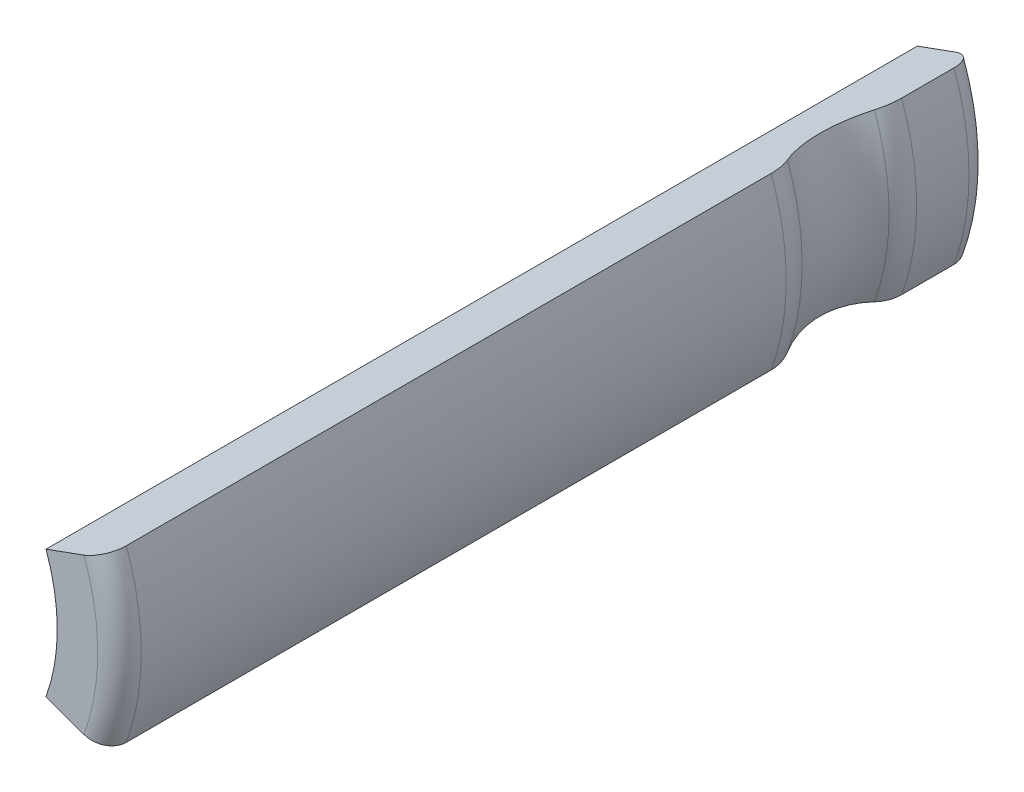
ISO-10303-21;
HEADER;
FILE_DESCRIPTION(('STEP AP214'),'2;1');
FILE_NAME('part.step','',(''),(''),'','','');
FILE_SCHEMA(('AUTOMOTIVE_DESIGN { 1 0 10303 214 1 1 1 1 }'));
ENDSEC;
DATA;
#1=APPLICATION_CONTEXT('core data for automotive mechanical design processes');
#2=APPLICATION_PROTOCOL_DEFINITION('international standard','automotive_design',2000,#1);
#3=PRODUCT_CONTEXT('',#1,'mechanical');
#4=PRODUCT('Part','Part','',(#3));
#5=PRODUCT_RELATED_PRODUCT_CATEGORY('part','',(#4));
#6=PRODUCT_DEFINITION_FORMATION('','',#4);
#7=PRODUCT_DEFINITION_CONTEXT('part definition',#1,'design');
#8=PRODUCT_DEFINITION('design','',#6,#7);
#9=PRODUCT_DEFINITION_SHAPE('','',#8);
#10=(LENGTH_UNIT() NAMED_UNIT(*) SI_UNIT(.MILLI.,.METRE.));
#11=(NAMED_UNIT(*) PLANE_ANGLE_UNIT() SI_UNIT($,.RADIAN.));
#12=(NAMED_UNIT(*) SI_UNIT($,.STERADIAN.) SOLID_ANGLE_UNIT());
#13=UNCERTAINTY_MEASURE_WITH_UNIT(LENGTH_MEASURE(1.E-05),#10,'distance_accuracy_value','');
#14=(GEOMETRIC_REPRESENTATION_CONTEXT(3) GLOBAL_UNCERTAINTY_ASSIGNED_CONTEXT((#13)) GLOBAL_UNIT_ASSIGNED_CONTEXT((#10,
#11,#12)) REPRESENTATION_CONTEXT('',''));
#15=CARTESIAN_POINT('',(0.,0.,0.));
#16=DIRECTION('',(0.,0.,1.));
#17=DIRECTION('',(1.,0.,0.));
#18=AXIS2_PLACEMENT_3D('',#15,#16,#17);
#19=CARTESIAN_POINT('',(1.66737283702201E-11,0.,-11.1292848324501));
#20=DIRECTION('',(0.,0.,1.));
#21=DIRECTION('',(1.,0.,0.));
#22=AXIS2_PLACEMENT_3D('',#19,#20,#21);
#23=TOROIDAL_SURFACE('',#22,1.82499999998395,0.175000000000223);
#24=CARTESIAN_POINT('',(1.71493903293384,-0.624186761569421,-11.12928483245));
#25=DIRECTION('',(-0.34202014332872,-0.939692620784798,0.));
#26=DIRECTION('',(0.939692620784798,-0.34202014332872,0.));
#27=AXIS2_PLACEMENT_3D('',#24,#25,#26);
#28=CIRCLE('',#27,0.175000000000223);
#29=CARTESIAN_POINT('',(1.71493903293355,-0.624186761569316,-10.9542848324499));
#30=VERTEX_POINT('',#29);
#31=CARTESIAN_POINT('',(1.87938524157162,-0.684040286651832,-11.12928483245));
#32=VERTEX_POINT('',#31);
#33=EDGE_CURVE('E116',#30,#32,#28,.F.);
#34=ORIENTED_EDGE('',*,*,#33,.T.);
#35=CARTESIAN_POINT('',(0.,0.,-11.12928483245));
#36=DIRECTION('',(0.,0.,1.));
#37=DIRECTION('',(1.,0.,0.));
#38=AXIS2_PLACEMENT_3D('',#35,#36,#37);
#39=CIRCLE('',#38,2.);
#40=CARTESIAN_POINT('',(1.87938524157153,0.684040286651523,-11.12928483245));
#41=VERTEX_POINT('',#40);
#42=EDGE_CURVE('E105',#41,#32,#39,.F.);
#43=ORIENTED_EDGE('',*,*,#42,.F.);
#44=CARTESIAN_POINT('',(1.71493903293342,0.624186761568764,-11.12928483245));
#45=DIRECTION('',(0.342020143328476,-0.939692620784886,0.));
#46=DIRECTION('',(0.939692620784886,0.342020143328476,0.));
#47=AXIS2_PLACEMENT_3D('',#44,#45,#46);
#48=CIRCLE('',#47,0.175000000000002);
#49=CARTESIAN_POINT('',(1.71493903293371,0.624186761568883,-10.95428483245));
#50=VERTEX_POINT('',#49);
#51=EDGE_CURVE('E21',#50,#41,#48,.F.);
#52=ORIENTED_EDGE('',*,*,#51,.F.);
#53=CARTESIAN_POINT('',(1.66643607993234E-11,0.,-10.9542848324501));
#54=DIRECTION('',(0.,0.,1.));
#55=DIRECTION('',(1.,0.,0.));
#56=AXIS2_PLACEMENT_3D('',#53,#54,#55);
#57=CIRCLE('',#56,1.82499999998396);
#58=EDGE_CURVE('E90',#30,#50,#57,.T.);
#59=ORIENTED_EDGE('',*,*,#58,.F.);
#60=EDGE_LOOP('',(#34,#43,#52,#59));
#61=FACE_BOUND('',#60,.T.);
#62=ADVANCED_FACE('F17',(#61),#23,.T.);
#63=CARTESIAN_POINT('',(0.,0.,-13.68428483245));
#64=DIRECTION('',(0.,0.,1.));
#65=DIRECTION('',(1.,0.,0.));
#66=AXIS2_PLACEMENT_3D('',#63,#64,#65);
#67=CYLINDRICAL_SURFACE('',#66,2.);
#68=ORIENTED_EDGE('',*,*,#42,.T.);
#69=DIRECTION('',(0.,0.,1.));
#70=VECTOR('',#69,1.);
#71=CARTESIAN_POINT('',(1.87938524157178,-0.684040286651612,-14.42792332895));
#72=LINE('',#71,#70);
#73=CARTESIAN_POINT('',(1.87938524157184,-0.684040286651637,-16.3104527983));
#74=VERTEX_POINT('',#73);
#75=EDGE_CURVE('E118',#32,#74,#72,.F.);
#76=ORIENTED_EDGE('',*,*,#75,.T.);
#77=CARTESIAN_POINT('',(-1.84357737409435E-12,0.,-16.3104527983));
#78=DIRECTION('',(0.,0.,-1.));
#79=DIRECTION('',(-1.,0.,0.));
#80=AXIS2_PLACEMENT_3D('',#77,#78,#79);
#81=CIRCLE('',#80,2.00000000000182);
#82=CARTESIAN_POINT('',(1.87938524157183,0.684040286651619,-16.3104527983));
#83=VERTEX_POINT('',#82);
#84=EDGE_CURVE('E143',#83,#74,#81,.T.);
#85=ORIENTED_EDGE('',*,*,#84,.F.);
#86=DIRECTION('',(0.,0.,1.));
#87=VECTOR('',#86,1.);
#88=CARTESIAN_POINT('',(1.87938524157178,0.684040286651612,-14.42792332895));
#89=LINE('',#88,#87);
#90=EDGE_CURVE('E109',#41,#83,#89,.F.);
#91=ORIENTED_EDGE('',*,*,#90,.F.);
#92=EDGE_LOOP('',(#68,#76,#85,#91));
#93=FACE_BOUND('',#92,.T.);
#94=ADVANCED_FACE('F224',(#93),#67,.T.);
#95=CARTESIAN_POINT('',(-1.84357737409435E-12,0.,-16.3104527983));
#96=DIRECTION('',(0.,0.,1.));
#97=DIRECTION('',(1.,0.,0.));
#98=AXIS2_PLACEMENT_3D('',#95,#96,#97);
#99=TOROIDAL_SURFACE('',#98,1.6500000000079,0.349999999994148);
#100=CARTESIAN_POINT('',(1.55049282430243,-0.564333236489776,-16.3104527983));
#101=DIRECTION('',(-0.342020143325502,-0.939692620785969,0.));
#102=DIRECTION('',(0.939692620785969,-0.342020143325502,0.));
#103=AXIS2_PLACEMENT_3D('',#100,#101,#102);
#104=CIRCLE('',#103,0.349999999994148);
#105=CARTESIAN_POINT('',(1.8355329192699,-0.668079346630483,-16.4850634763498));
#106=VERTEX_POINT('',#105);
#107=EDGE_CURVE('E168',#74,#106,#104,.F.);
#108=ORIENTED_EDGE('',*,*,#107,.T.);
#109=CARTESIAN_POINT('',(8.68088153443969E-12,0.,-16.48506347635));
#110=DIRECTION('',(0.,0.,1.));
#111=DIRECTION('',(1.,0.,0.));
#112=AXIS2_PLACEMENT_3D('',#109,#110,#111);
#113=CIRCLE('',#112,1.95333333332457);
#114=CARTESIAN_POINT('',(1.83553291926894,0.668079346629917,-16.48506347635));
#115=VERTEX_POINT('',#114);
#116=EDGE_CURVE('E140',#106,#115,#113,.T.);
#117=ORIENTED_EDGE('',*,*,#116,.T.);
#118=CARTESIAN_POINT('',(1.55049282429851,0.56433323648833,-16.3104527983));
#119=DIRECTION('',(0.342020143325491,-0.939692620785973,0.));
#120=DIRECTION('',(0.939692620785973,0.342020143325491,0.));
#121=AXIS2_PLACEMENT_3D('',#118,#119,#120);
#122=CIRCLE('',#121,0.349999999998239);
#123=EDGE_CURVE('E130',#83,#115,#122,.F.);
#124=ORIENTED_EDGE('',*,*,#123,.F.);
#125=ORIENTED_EDGE('',*,*,#84,.T.);
#126=EDGE_LOOP('',(#108,#117,#124,#125));
#127=FACE_BOUND('',#126,.T.);
#128=ADVANCED_FACE('F180',(#127),#99,.T.);
#129=CARTESIAN_POINT('',(8.68098995465694E-12,0.,-16.8342848324579));
#130=DIRECTION('',(0.,0.,1.));
#131=DIRECTION('',(1.,0.,0.));
#132=AXIS2_PLACEMENT_3D('',#129,#130,#131);
#133=TOROIDAL_SURFACE('',#132,2.56000000000732,0.700000000014485);
#134=ORIENTED_EDGE('',*,*,#116,.F.);
#135=CARTESIAN_POINT('',(2.40561310922603,-0.87557156692019,-16.8342848324579));
#136=DIRECTION('',(-0.342020143327222,-0.939692620785343,0.));
#137=DIRECTION('',(0.939692620785343,-0.342020143327222,0.));
#138=AXIS2_PLACEMENT_3D('',#135,#136,#137);
#139=CIRCLE('',#138,0.700000000014485);
#140=CARTESIAN_POINT('',(1.83553291927173,-0.668079346630897,-17.183506188562));
#141=VERTEX_POINT('',#140);
#142=EDGE_CURVE('E165',#106,#141,#139,.T.);
#143=ORIENTED_EDGE('',*,*,#142,.T.);
#144=CARTESIAN_POINT('',(1.06109782418984E-11,0.,-17.1835061885502));
#145=DIRECTION('',(0.,0.,-1.));
#146=DIRECTION('',(-1.,0.,0.));
#147=AXIS2_PLACEMENT_3D('',#144,#145,#146);
#148=CIRCLE('',#147,1.95333333332257);
#149=CARTESIAN_POINT('',(1.8355329192709,0.66807934663057,-17.1835061885616));
#150=VERTEX_POINT('',#149);
#151=EDGE_CURVE('E136',#150,#141,#148,.T.);
#152=ORIENTED_EDGE('',*,*,#151,.F.);
#153=CARTESIAN_POINT('',(2.40561310922603,0.875571566920189,-16.8342848324579));
#154=DIRECTION('',(0.342020143327221,-0.939692620785343,0.));
#155=DIRECTION('',(0.939692620785343,0.342020143327221,0.));
#156=AXIS2_PLACEMENT_3D('',#153,#154,#155);
#157=CIRCLE('',#156,0.700000000014485);
#158=EDGE_CURVE('E174',#115,#150,#157,.T.);
#159=ORIENTED_EDGE('',*,*,#158,.F.);
#160=EDGE_LOOP('',(#134,#143,#152,#159));
#161=FACE_BOUND('',#160,.T.);
#162=ADVANCED_FACE('F184',(#161),#133,.F.);
#163=CARTESIAN_POINT('',(1.06258318116614E-11,0.,-17.3581168665901));
#164=DIRECTION('',(0.,0.,1.));
#165=DIRECTION('',(1.,0.,0.));
#166=AXIS2_PLACEMENT_3D('',#163,#164,#165);
#167=TOROIDAL_SURFACE('',#166,1.65000000007033,0.349999999922445);
#168=CARTESIAN_POINT('',(1.55049282437234,-0.564333236514496,-17.35811686659));
#169=DIRECTION('',(-0.342020143327541,-0.939692620785227,0.));
#170=DIRECTION('',(0.939692620785227,-0.342020143327541,0.));
#171=AXIS2_PLACEMENT_3D('',#168,#169,#170);
#172=CIRCLE('',#171,0.349999999922445);
#173=CARTESIAN_POINT('',(1.87938524157239,-0.684040286651875,-17.35811686659));
#174=VERTEX_POINT('',#173);
#175=EDGE_CURVE('E162',#141,#174,#172,.F.);
#176=ORIENTED_EDGE('',*,*,#175,.T.);
#177=CARTESIAN_POINT('',(0.,0.,-17.35811686659));
#178=DIRECTION('',(0.,0.,1.));
#179=DIRECTION('',(1.,0.,0.));
#180=AXIS2_PLACEMENT_3D('',#177,#178,#179);
#181=CIRCLE('',#180,2.);
#182=CARTESIAN_POINT('',(1.8793852415722,0.684040286651767,-17.35811686659));
#183=VERTEX_POINT('',#182);
#184=EDGE_CURVE('E132',#183,#174,#181,.F.);
#185=ORIENTED_EDGE('',*,*,#184,.F.);
#186=CARTESIAN_POINT('',(1.55049282436773,0.564333236512751,-17.35811686659));
#187=DIRECTION('',(0.342020143327504,-0.93969262078524,0.));
#188=DIRECTION('',(0.939692620785241,0.342020143327504,0.));
#189=AXIS2_PLACEMENT_3D('',#186,#187,#188);
#190=CIRCLE('',#189,0.349999999926535);
#191=EDGE_CURVE('E128',#150,#183,#190,.F.);
#192=ORIENTED_EDGE('',*,*,#191,.F.);
#193=ORIENTED_EDGE('',*,*,#151,.T.);
#194=EDGE_LOOP('',(#176,#185,#192,#193));
#195=FACE_BOUND('',#194,.T.);
#196=ADVANCED_FACE('F187',(#195),#167,.T.);
#197=CARTESIAN_POINT('',(0.,0.,-17.60428483245));
#198=DIRECTION('',(0.,0.,1.));
#199=DIRECTION('',(1.,0.,0.));
#200=AXIS2_PLACEMENT_3D('',#197,#198,#199);
#201=CYLINDRICAL_SURFACE('',#200,2.);
#202=ORIENTED_EDGE('',*,*,#184,.T.);
#203=DIRECTION('',(0.,0.,1.));
#204=VECTOR('',#203,1.);
#205=CARTESIAN_POINT('',(1.87938524157178,-0.684040286651612,-14.42792332895));
#206=LINE('',#205,#204);
#207=CARTESIAN_POINT('',(1.87938524157173,-0.684040286651596,-17.77928483245));
#208=VERTEX_POINT('',#207);
#209=EDGE_CURVE('E161',#174,#208,#206,.F.);
#210=ORIENTED_EDGE('',*,*,#209,.T.);
#211=CARTESIAN_POINT('',(-1.84823944343604E-12,0.,-17.77928483245));
#212=DIRECTION('',(0.,0.,-1.));
#213=DIRECTION('',(-1.,0.,0.));
#214=AXIS2_PLACEMENT_3D('',#211,#212,#213);
#215=CIRCLE('',#214,2.00000000000182);
#216=CARTESIAN_POINT('',(1.87938524157181,0.684040286651578,-17.77928483245));
#217=VERTEX_POINT('',#216);
#218=EDGE_CURVE('E110',#217,#208,#215,.T.);
#219=ORIENTED_EDGE('',*,*,#218,.F.);
#220=DIRECTION('',(0.,0.,1.));
#221=VECTOR('',#220,1.);
#222=CARTESIAN_POINT('',(1.87938524157178,0.684040286651612,-14.42792332895));
#223=LINE('',#222,#221);
#224=EDGE_CURVE('E125',#183,#217,#223,.F.);
#225=ORIENTED_EDGE('',*,*,#224,.F.);
#226=EDGE_LOOP('',(#202,#210,#219,#225));
#227=FACE_BOUND('',#226,.T.);
#228=ADVANCED_FACE('F221',(#227),#201,.T.);
#229=CARTESIAN_POINT('',(-1.84834786365329E-12,0.,-17.77928483245));
#230=DIRECTION('',(0.,0.,1.));
#231=DIRECTION('',(1.,0.,0.));
#232=AXIS2_PLACEMENT_3D('',#229,#230,#231);
#233=TOROIDAL_SURFACE('',#232,1.82500000000135,0.175000000000219);
#234=CARTESIAN_POINT('',(1.71493903293382,-0.624186761569499,-17.77928483245));
#235=DIRECTION('',(-0.342020143325502,-0.939692620785969,0.));
#236=DIRECTION('',(0.939692620785969,-0.342020143325502,0.));
#237=AXIS2_PLACEMENT_3D('',#234,#235,#236);
#238=CIRCLE('',#237,0.175000000000219);
#239=CARTESIAN_POINT('',(1.71493903293391,-0.62418676156925,-17.9542848324501));
#240=VERTEX_POINT('',#239);
#241=EDGE_CURVE('E158',#208,#240,#238,.F.);
#242=ORIENTED_EDGE('',*,*,#241,.T.);
#243=CARTESIAN_POINT('',(-1.84834786365329E-12,0.,-17.9542848324502));
#244=DIRECTION('',(0.,0.,1.));
#245=DIRECTION('',(1.,0.,0.));
#246=AXIS2_PLACEMENT_3D('',#243,#244,#245);
#247=CIRCLE('',#246,1.82500000000135);
#248=CARTESIAN_POINT('',(1.71493903293439,0.624186761569381,-17.95428483245));
#249=VERTEX_POINT('',#248);
#250=EDGE_CURVE('E155',#249,#240,#247,.F.);
#251=ORIENTED_EDGE('',*,*,#250,.F.);
#252=CARTESIAN_POINT('',(1.71493903293431,0.624186761569592,-17.77928483245));
#253=DIRECTION('',(0.34202014332546,-0.939692620785984,0.));
#254=DIRECTION('',(0.939692620785984,0.34202014332546,0.));
#255=AXIS2_PLACEMENT_3D('',#252,#253,#254);
#256=CIRCLE('',#255,0.174999999999999);
#257=EDGE_CURVE('E101',#217,#249,#256,.F.);
#258=ORIENTED_EDGE('',*,*,#257,.F.);
#259=ORIENTED_EDGE('',*,*,#218,.T.);
#260=EDGE_LOOP('',(#242,#251,#258,#259));
#261=FACE_BOUND('',#260,.T.);
#262=ADVANCED_FACE('F19',(#261),#233,.T.);
#263=CARTESIAN_POINT('',(1.637893575607,0.596144508417,-14.42792332895));
#264=DIRECTION('',(-0.342020143325932,0.939692620785813,0.));
#265=DIRECTION('',(-0.939692620785813,-0.342020143325932,0.));
#266=AXIS2_PLACEMENT_3D('',#263,#264,#265);
#267=PLANE('',#266);
#268=ORIENTED_EDGE('',*,*,#257,.T.);
#269=DIRECTION('',(0.93969262078659,0.342020143323795,0.));
#270=VECTOR('',#269,1.);
#271=CARTESIAN_POINT('',(1.409538931179,0.513030214989,-17.95428483245));
#272=LINE('',#271,#270);
#273=CARTESIAN_POINT('',(1.40953893117872,0.513030214988898,-17.95428483245));
#274=VERTEX_POINT('',#273);
#275=EDGE_CURVE('E157',#274,#249,#272,.T.);
#276=ORIENTED_EDGE('',*,*,#275,.F.);
#277=DIRECTION('',(0.,0.,1.));
#278=VECTOR('',#277,1.);
#279=CARTESIAN_POINT('',(1.40953893117872,0.513030214988898,-14.45428483245));
#280=LINE('',#279,#278);
#281=CARTESIAN_POINT('',(1.40953893117872,0.513030214988898,-10.95428483245));
#282=VERTEX_POINT('',#281);
#283=EDGE_CURVE('E115',#274,#282,#280,.T.);
#284=ORIENTED_EDGE('',*,*,#283,.T.);
#285=DIRECTION('',(-0.93969262078659,-0.342020143323796,0.));
#286=VECTOR('',#285,1.);
#287=CARTESIAN_POINT('',(1.714939032934,0.624186761569,-10.95428483245));
#288=LINE('',#287,#286);
#289=EDGE_CURVE('E95',#50,#282,#288,.T.);
#290=ORIENTED_EDGE('',*,*,#289,.F.);
#291=ORIENTED_EDGE('',*,*,#51,.T.);
#292=ORIENTED_EDGE('',*,*,#90,.T.);
#293=ORIENTED_EDGE('',*,*,#123,.T.);
#294=ORIENTED_EDGE('',*,*,#158,.T.);
#295=ORIENTED_EDGE('',*,*,#191,.T.);
#296=ORIENTED_EDGE('',*,*,#224,.T.);
#297=EDGE_LOOP('',(#268,#276,#284,#290,#291,#292,#293,#294,#295,#296));
#298=FACE_BOUND('',#297,.T.);
#299=ADVANCED_FACE('F112',(#298),#267,.T.);
#300=CARTESIAN_POINT('',(1.409538931179,-0.513030214989,-10.95428483245));
#301=DIRECTION('',(0.,0.,1.));
#302=DIRECTION('',(1.,0.,0.));
#303=AXIS2_PLACEMENT_3D('',#300,#301,#302);
#304=PLANE('',#303);
#305=ORIENTED_EDGE('',*,*,#58,.T.);
#306=ORIENTED_EDGE('',*,*,#289,.T.);
#307=CARTESIAN_POINT('',(0.,0.,-10.95428483245));
#308=DIRECTION('',(0.,0.,1.));
#309=DIRECTION('',(1.,0.,0.));
#310=AXIS2_PLACEMENT_3D('',#307,#308,#309);
#311=CIRCLE('',#310,1.5);
#312=CARTESIAN_POINT('',(1.40953893117877,-0.513030214988763,-10.95428483245));
#313=VERTEX_POINT('',#312);
#314=EDGE_CURVE('E124',#282,#313,#311,.F.);
#315=ORIENTED_EDGE('',*,*,#314,.T.);
#316=DIRECTION('',(-0.939692620785813,0.342020143325932,0.));
#317=VECTOR('',#316,1.);
#318=CARTESIAN_POINT('',(1.637893575607,-0.596144508417,-10.95428483245));
#319=LINE('',#318,#317);
#320=EDGE_CURVE('E97',#313,#30,#319,.F.);
#321=ORIENTED_EDGE('',*,*,#320,.T.);
#322=EDGE_LOOP('',(#305,#306,#315,#321));
#323=FACE_BOUND('',#322,.T.);
#324=ADVANCED_FACE('F92',(#323),#304,.T.);
#325=CARTESIAN_POINT('',(1.637893575607,-0.596144508417,-14.42792332895));
#326=DIRECTION('',(0.342020143325932,0.939692620785813,0.));
#327=DIRECTION('',(-0.939692620785813,0.342020143325932,0.));
#328=AXIS2_PLACEMENT_3D('',#325,#326,#327);
#329=PLANE('',#328);
#330=DIRECTION('',(0.,0.,1.));
#331=VECTOR('',#330,1.);
#332=CARTESIAN_POINT('',(1.40953893117872,-0.513030214988898,-14.45428483245));
#333=LINE('',#332,#331);
#334=CARTESIAN_POINT('',(1.40953893117872,-0.513030214988898,-17.95428483245));
#335=VERTEX_POINT('',#334);
#336=EDGE_CURVE('E27',#313,#335,#333,.F.);
#337=ORIENTED_EDGE('',*,*,#336,.T.);
#338=DIRECTION('',(-0.93969262078659,0.342020143323796,0.));
#339=VECTOR('',#338,1.);
#340=CARTESIAN_POINT('',(1.714939032934,-0.624186761569,-17.95428483245));
#341=LINE('',#340,#339);
#342=EDGE_CURVE('E35',#240,#335,#341,.T.);
#343=ORIENTED_EDGE('',*,*,#342,.F.);
#344=ORIENTED_EDGE('',*,*,#241,.F.);
#345=ORIENTED_EDGE('',*,*,#209,.F.);
#346=ORIENTED_EDGE('',*,*,#175,.F.);
#347=ORIENTED_EDGE('',*,*,#142,.F.);
#348=ORIENTED_EDGE('',*,*,#107,.F.);
#349=ORIENTED_EDGE('',*,*,#75,.F.);
#350=ORIENTED_EDGE('',*,*,#33,.F.);
#351=ORIENTED_EDGE('',*,*,#320,.F.);
#352=EDGE_LOOP('',(#337,#343,#344,#345,#346,#347,#348,#349,#350,#351));
#353=FACE_BOUND('',#352,.T.);
#354=ADVANCED_FACE('F191',(#353),#329,.F.);
#355=CARTESIAN_POINT('',(1.879385241572,-0.684040286651,-17.95428483245));
#356=DIRECTION('',(0.,0.,-1.));
#357=DIRECTION('',(-1.,0.,0.));
#358=AXIS2_PLACEMENT_3D('',#355,#356,#357);
#359=PLANE('',#358);
#360=ORIENTED_EDGE('',*,*,#250,.T.);
#361=ORIENTED_EDGE('',*,*,#342,.T.);
#362=CARTESIAN_POINT('',(0.,0.,-17.95428483245));
#363=DIRECTION('',(0.,0.,1.));
#364=DIRECTION('',(1.,0.,0.));
#365=AXIS2_PLACEMENT_3D('',#362,#363,#364);
#366=CIRCLE('',#365,1.5);
#367=EDGE_CURVE('E11',#335,#274,#366,.T.);
#368=ORIENTED_EDGE('',*,*,#367,.T.);
#369=ORIENTED_EDGE('',*,*,#275,.T.);
#370=EDGE_LOOP('',(#360,#361,#368,#369));
#371=FACE_BOUND('',#370,.T.);
#372=ADVANCED_FACE('F200',(#371),#359,.T.);
#373=CARTESIAN_POINT('',(0.,0.,-14.45428483245));
#374=DIRECTION('',(0.,0.,1.));
#375=DIRECTION('',(1.,0.,0.));
#376=AXIS2_PLACEMENT_3D('',#373,#374,#375);
#377=CYLINDRICAL_SURFACE('',#376,1.5);
#378=ORIENTED_EDGE('',*,*,#367,.F.);
#379=ORIENTED_EDGE('',*,*,#336,.F.);
#380=ORIENTED_EDGE('',*,*,#314,.F.);
#381=ORIENTED_EDGE('',*,*,#283,.F.);
#382=EDGE_LOOP('',(#378,#379,#380,#381));
#383=FACE_BOUND('',#382,.T.);
#384=ADVANCED_FACE('F206',(#383),#377,.F.);
#385=CLOSED_SHELL('',(#62,#94,#128,#162,#196,#228,#262,#299,#324,#354,#372,#384));
#386=MANIFOLD_SOLID_BREP('B1',#385);
#387=ADVANCED_BREP_SHAPE_REPRESENTATION('',(#18,#386),#14);
#388=SHAPE_DEFINITION_REPRESENTATION(#9,#387);
ENDSEC;
END-ISO-10303-21;
